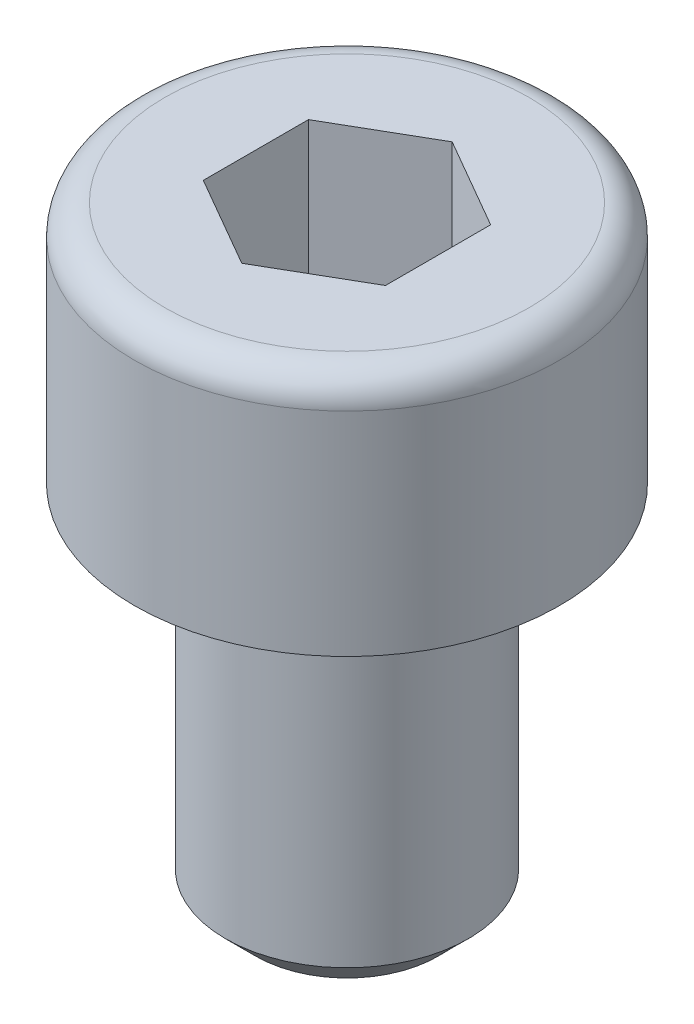
ISO-10303-21;
HEADER;
FILE_DESCRIPTION(('STEP AP214'),'2;1');
FILE_NAME('part.step','',(''),(''),'','','');
FILE_SCHEMA(('AUTOMOTIVE_DESIGN { 1 0 10303 214 1 1 1 1 }'));
ENDSEC;
DATA;
#1=APPLICATION_CONTEXT('core data for automotive mechanical design processes');
#2=APPLICATION_PROTOCOL_DEFINITION('international standard','automotive_design',2000,#1);
#3=PRODUCT_CONTEXT('',#1,'mechanical');
#4=PRODUCT('Part','Part','',(#3));
#5=PRODUCT_RELATED_PRODUCT_CATEGORY('part','',(#4));
#6=PRODUCT_DEFINITION_FORMATION('','',#4);
#7=PRODUCT_DEFINITION_CONTEXT('part definition',#1,'design');
#8=PRODUCT_DEFINITION('design','',#6,#7);
#9=PRODUCT_DEFINITION_SHAPE('','',#8);
#10=(LENGTH_UNIT() NAMED_UNIT(*) SI_UNIT(.MILLI.,.METRE.));
#11=(NAMED_UNIT(*) PLANE_ANGLE_UNIT() SI_UNIT($,.RADIAN.));
#12=(NAMED_UNIT(*) SI_UNIT($,.STERADIAN.) SOLID_ANGLE_UNIT());
#13=UNCERTAINTY_MEASURE_WITH_UNIT(LENGTH_MEASURE(1.E-05),#10,'distance_accuracy_value','');
#14=(GEOMETRIC_REPRESENTATION_CONTEXT(3) GLOBAL_UNCERTAINTY_ASSIGNED_CONTEXT((#13)) GLOBAL_UNIT_ASSIGNED_CONTEXT((#10,
#11,#12)) REPRESENTATION_CONTEXT('',''));
#15=CARTESIAN_POINT('',(0.,0.,0.));
#16=DIRECTION('',(0.,0.,1.));
#17=DIRECTION('',(1.,0.,0.));
#18=AXIS2_PLACEMENT_3D('',#15,#16,#17);
#19=CARTESIAN_POINT('',(0.,0.,0.));
#20=DIRECTION('',(0.,-1.,0.));
#21=DIRECTION('',(0.,0.,-1.));
#22=AXIS2_PLACEMENT_3D('',#19,#20,#21);
#23=PLANE('',#22);
#24=CARTESIAN_POINT('',(0.,0.,0.));
#25=DIRECTION('',(0.,-1.,0.));
#26=DIRECTION('',(0.,0.,-1.));
#27=AXIS2_PLACEMENT_3D('',#24,#25,#26);
#28=CIRCLE('',#27,3.);
#29=CARTESIAN_POINT('',(0.,0.,-3.));
#30=VERTEX_POINT('',#29);
#31=EDGE_CURVE('E47',#30,#30,#28,.F.);
#32=ORIENTED_EDGE('',*,*,#31,.T.);
#33=EDGE_LOOP('',(#32));
#34=FACE_BOUND('',#33,.T.);
#35=DIRECTION('',(-0.866025403784439,0.,-0.5));
#36=VECTOR('',#35,1.);
#37=CARTESIAN_POINT('',(1.5,0.,-0.866025403784438));
#38=LINE('',#37,#36);
#39=CARTESIAN_POINT('',(1.5,0.,-0.866025403784438));
#40=VERTEX_POINT('',#39);
#41=CARTESIAN_POINT('',(0.,0.,-1.73205080756888));
#42=VERTEX_POINT('',#41);
#43=EDGE_CURVE('E135',#40,#42,#38,.T.);
#44=ORIENTED_EDGE('',*,*,#43,.F.);
#45=DIRECTION('',(0.,0.,-1.));
#46=VECTOR('',#45,1.);
#47=CARTESIAN_POINT('',(1.5,0.,0.866025403784439));
#48=LINE('',#47,#46);
#49=CARTESIAN_POINT('',(1.5,0.,0.866025403784439));
#50=VERTEX_POINT('',#49);
#51=EDGE_CURVE('E54',#50,#40,#48,.T.);
#52=ORIENTED_EDGE('',*,*,#51,.F.);
#53=DIRECTION('',(0.866025403784439,0.,-0.5));
#54=VECTOR('',#53,1.);
#55=CARTESIAN_POINT('',(0.,0.,1.73205080756888));
#56=LINE('',#55,#54);
#57=CARTESIAN_POINT('',(0.,0.,1.73205080756888));
#58=VERTEX_POINT('',#57);
#59=EDGE_CURVE('E148',#58,#50,#56,.T.);
#60=ORIENTED_EDGE('',*,*,#59,.F.);
#61=DIRECTION('',(0.866025403784439,0.,0.5));
#62=VECTOR('',#61,1.);
#63=CARTESIAN_POINT('',(-1.5,0.,0.866025403784438));
#64=LINE('',#63,#62);
#65=CARTESIAN_POINT('',(-1.5,0.,0.866025403784438));
#66=VERTEX_POINT('',#65);
#67=EDGE_CURVE('E145',#66,#58,#64,.T.);
#68=ORIENTED_EDGE('',*,*,#67,.F.);
#69=DIRECTION('',(0.,0.,1.));
#70=VECTOR('',#69,1.);
#71=CARTESIAN_POINT('',(-1.5,0.,-0.866025403784439));
#72=LINE('',#71,#70);
#73=CARTESIAN_POINT('',(-1.5,0.,-0.866025403784439));
#74=VERTEX_POINT('',#73);
#75=EDGE_CURVE('E102',#74,#66,#72,.T.);
#76=ORIENTED_EDGE('',*,*,#75,.F.);
#77=DIRECTION('',(-0.866025403784439,0.,0.5));
#78=VECTOR('',#77,1.);
#79=CARTESIAN_POINT('',(0.,0.,-1.73205080756888));
#80=LINE('',#79,#78);
#81=EDGE_CURVE('E139',#42,#74,#80,.T.);
#82=ORIENTED_EDGE('',*,*,#81,.F.);
#83=EDGE_LOOP('',(#44,#52,#60,#68,#76,#82));
#84=FACE_BOUND('',#83,.T.);
#85=ADVANCED_FACE('F38',(#34,#84),#23,.F.);
#86=CARTESIAN_POINT('',(0.,0.,0.));
#87=DIRECTION('',(0.,1.,0.));
#88=DIRECTION('',(0.,0.,1.));
#89=AXIS2_PLACEMENT_3D('',#86,#87,#88);
#90=CYLINDRICAL_SURFACE('',#89,3.5);
#91=CARTESIAN_POINT('',(0.,-0.5,0.));
#92=DIRECTION('',(0.,-1.,0.));
#93=DIRECTION('',(0.,0.,-1.));
#94=AXIS2_PLACEMENT_3D('',#91,#92,#93);
#95=CIRCLE('',#94,3.5);
#96=CARTESIAN_POINT('',(0.,-0.5,-3.5));
#97=VERTEX_POINT('',#96);
#98=EDGE_CURVE('E11',#97,#97,#95,.T.);
#99=ORIENTED_EDGE('',*,*,#98,.T.);
#100=EDGE_LOOP('',(#99));
#101=FACE_BOUND('',#100,.T.);
#102=CARTESIAN_POINT('',(0.,-4.,0.));
#103=DIRECTION('',(0.,1.,0.));
#104=DIRECTION('',(0.,0.,1.));
#105=AXIS2_PLACEMENT_3D('',#102,#103,#104);
#106=CIRCLE('',#105,3.5);
#107=CARTESIAN_POINT('',(0.,-4.,3.5));
#108=VERTEX_POINT('',#107);
#109=EDGE_CURVE('E166',#108,#108,#106,.T.);
#110=ORIENTED_EDGE('',*,*,#109,.T.);
#111=EDGE_LOOP('',(#110));
#112=FACE_BOUND('',#111,.T.);
#113=ADVANCED_FACE('F192',(#101,#112),#90,.T.);
#114=CARTESIAN_POINT('',(3.5,-4.,0.));
#115=DIRECTION('',(0.,1.,0.));
#116=DIRECTION('',(0.,0.,1.));
#117=AXIS2_PLACEMENT_3D('',#114,#115,#116);
#118=PLANE('',#117);
#119=ORIENTED_EDGE('',*,*,#109,.F.);
#120=EDGE_LOOP('',(#119));
#121=FACE_BOUND('',#120,.T.);
#122=CARTESIAN_POINT('',(0.,-4.,0.));
#123=DIRECTION('',(0.,1.,0.));
#124=DIRECTION('',(0.,0.,1.));
#125=AXIS2_PLACEMENT_3D('',#122,#123,#124);
#126=CIRCLE('',#125,2.);
#127=CARTESIAN_POINT('',(0.,-4.,2.));
#128=VERTEX_POINT('',#127);
#129=EDGE_CURVE('E154',#128,#128,#126,.T.);
#130=ORIENTED_EDGE('',*,*,#129,.T.);
#131=EDGE_LOOP('',(#130));
#132=FACE_BOUND('',#131,.T.);
#133=ADVANCED_FACE('F197',(#121,#132),#118,.F.);
#134=CARTESIAN_POINT('',(0.,0.,0.));
#135=DIRECTION('',(0.,1.,0.));
#136=DIRECTION('',(0.,0.,1.));
#137=AXIS2_PLACEMENT_3D('',#134,#135,#136);
#138=CYLINDRICAL_SURFACE('',#137,2.);
#139=CARTESIAN_POINT('',(0.,-9.5,0.));
#140=DIRECTION('',(0.,1.,0.));
#141=DIRECTION('',(0.,0.,1.));
#142=AXIS2_PLACEMENT_3D('',#139,#140,#141);
#143=CIRCLE('',#142,2.);
#144=CARTESIAN_POINT('',(0.,-9.5,2.));
#145=VERTEX_POINT('',#144);
#146=EDGE_CURVE('E170',#145,#145,#143,.T.);
#147=ORIENTED_EDGE('',*,*,#146,.T.);
#148=EDGE_LOOP('',(#147));
#149=FACE_BOUND('',#148,.T.);
#150=ORIENTED_EDGE('',*,*,#129,.F.);
#151=EDGE_LOOP('',(#150));
#152=FACE_BOUND('',#151,.T.);
#153=ADVANCED_FACE('F203',(#149,#152),#138,.T.);
#154=CARTESIAN_POINT('',(2.,-10.,0.));
#155=DIRECTION('',(0.,1.,0.));
#156=DIRECTION('',(0.,0.,1.));
#157=AXIS2_PLACEMENT_3D('',#154,#155,#156);
#158=PLANE('',#157);
#159=CARTESIAN_POINT('',(0.,-10.,0.));
#160=DIRECTION('',(0.,1.,0.));
#161=DIRECTION('',(0.,0.,1.));
#162=AXIS2_PLACEMENT_3D('',#159,#160,#161);
#163=CIRCLE('',#162,1.5);
#164=CARTESIAN_POINT('',(0.,-10.,1.5));
#165=VERTEX_POINT('',#164);
#166=EDGE_CURVE('E174',#165,#165,#163,.F.);
#167=ORIENTED_EDGE('',*,*,#166,.T.);
#168=EDGE_LOOP('',(#167));
#169=FACE_BOUND('',#168,.T.);
#170=ADVANCED_FACE('F207',(#169),#158,.F.);
#171=CARTESIAN_POINT('',(1.5,-3.,0.866025403784439));
#172=DIRECTION('',(1.,0.,0.));
#173=DIRECTION('',(0.,0.,-1.));
#174=AXIS2_PLACEMENT_3D('',#171,#172,#173);
#175=PLANE('',#174);
#176=ORIENTED_EDGE('',*,*,#51,.T.);
#177=DIRECTION('',(0.,1.,0.));
#178=VECTOR('',#177,1.);
#179=CARTESIAN_POINT('',(1.5,-3.,-0.866025403784438));
#180=LINE('',#179,#178);
#181=CARTESIAN_POINT('',(1.5,-3.,-0.866025403784438));
#182=VERTEX_POINT('',#181);
#183=EDGE_CURVE('E84',#182,#40,#180,.T.);
#184=ORIENTED_EDGE('',*,*,#183,.F.);
#185=DIRECTION('',(0.,0.,-1.));
#186=VECTOR('',#185,1.);
#187=CARTESIAN_POINT('',(1.5,-3.,0.866025403784439));
#188=LINE('',#187,#186);
#189=CARTESIAN_POINT('',(1.5,-3.,0.866025403784439));
#190=VERTEX_POINT('',#189);
#191=EDGE_CURVE('E151',#190,#182,#188,.T.);
#192=ORIENTED_EDGE('',*,*,#191,.F.);
#193=DIRECTION('',(0.,1.,0.));
#194=VECTOR('',#193,1.);
#195=CARTESIAN_POINT('',(1.5,-3.,0.866025403784439));
#196=LINE('',#195,#194);
#197=EDGE_CURVE('E62',#190,#50,#196,.T.);
#198=ORIENTED_EDGE('',*,*,#197,.T.);
#199=EDGE_LOOP('',(#176,#184,#192,#198));
#200=FACE_BOUND('',#199,.T.);
#201=ADVANCED_FACE('F211',(#200),#175,.F.);
#202=CARTESIAN_POINT('',(0.,-3.,1.73205080756888));
#203=DIRECTION('',(0.5,0.,0.866025403784439));
#204=DIRECTION('',(0.866025403784439,0.,-0.5));
#205=AXIS2_PLACEMENT_3D('',#202,#203,#204);
#206=PLANE('',#205);
#207=ORIENTED_EDGE('',*,*,#59,.T.);
#208=ORIENTED_EDGE('',*,*,#197,.F.);
#209=DIRECTION('',(0.866025403784439,0.,-0.5));
#210=VECTOR('',#209,1.);
#211=CARTESIAN_POINT('',(0.,-3.,1.73205080756888));
#212=LINE('',#211,#210);
#213=CARTESIAN_POINT('',(0.,-3.,1.73205080756888));
#214=VERTEX_POINT('',#213);
#215=EDGE_CURVE('E116',#214,#190,#212,.T.);
#216=ORIENTED_EDGE('',*,*,#215,.F.);
#217=DIRECTION('',(0.,1.,0.));
#218=VECTOR('',#217,1.);
#219=CARTESIAN_POINT('',(0.,-3.,1.73205080756888));
#220=LINE('',#219,#218);
#221=EDGE_CURVE('E107',#214,#58,#220,.T.);
#222=ORIENTED_EDGE('',*,*,#221,.T.);
#223=EDGE_LOOP('',(#207,#208,#216,#222));
#224=FACE_BOUND('',#223,.T.);
#225=ADVANCED_FACE('F215',(#224),#206,.F.);
#226=CARTESIAN_POINT('',(-1.5,-3.,0.866025403784438));
#227=DIRECTION('',(-0.5,0.,0.866025403784438));
#228=DIRECTION('',(0.866025403784439,0.,0.5));
#229=AXIS2_PLACEMENT_3D('',#226,#227,#228);
#230=PLANE('',#229);
#231=ORIENTED_EDGE('',*,*,#67,.T.);
#232=ORIENTED_EDGE('',*,*,#221,.F.);
#233=DIRECTION('',(0.866025403784439,0.,0.5));
#234=VECTOR('',#233,1.);
#235=CARTESIAN_POINT('',(-1.5,-3.,0.866025403784438));
#236=LINE('',#235,#234);
#237=CARTESIAN_POINT('',(-1.5,-3.,0.866025403784438));
#238=VERTEX_POINT('',#237);
#239=EDGE_CURVE('E111',#238,#214,#236,.T.);
#240=ORIENTED_EDGE('',*,*,#239,.F.);
#241=DIRECTION('',(0.,1.,0.));
#242=VECTOR('',#241,1.);
#243=CARTESIAN_POINT('',(-1.5,-3.,0.866025403784438));
#244=LINE('',#243,#242);
#245=EDGE_CURVE('E95',#238,#66,#244,.T.);
#246=ORIENTED_EDGE('',*,*,#245,.T.);
#247=EDGE_LOOP('',(#231,#232,#240,#246));
#248=FACE_BOUND('',#247,.T.);
#249=ADVANCED_FACE('F112',(#248),#230,.F.);
#250=CARTESIAN_POINT('',(-1.5,-3.,-0.866025403784439));
#251=DIRECTION('',(-1.,0.,0.));
#252=DIRECTION('',(0.,0.,1.));
#253=AXIS2_PLACEMENT_3D('',#250,#251,#252);
#254=PLANE('',#253);
#255=ORIENTED_EDGE('',*,*,#75,.T.);
#256=ORIENTED_EDGE('',*,*,#245,.F.);
#257=DIRECTION('',(0.,0.,1.));
#258=VECTOR('',#257,1.);
#259=CARTESIAN_POINT('',(-1.5,-3.,-0.866025403784439));
#260=LINE('',#259,#258);
#261=CARTESIAN_POINT('',(-1.5,-3.,-0.866025403784439));
#262=VERTEX_POINT('',#261);
#263=EDGE_CURVE('E99',#262,#238,#260,.T.);
#264=ORIENTED_EDGE('',*,*,#263,.F.);
#265=DIRECTION('',(0.,1.,0.));
#266=VECTOR('',#265,1.);
#267=CARTESIAN_POINT('',(-1.5,-3.,-0.866025403784439));
#268=LINE('',#267,#266);
#269=EDGE_CURVE('E108',#262,#74,#268,.T.);
#270=ORIENTED_EDGE('',*,*,#269,.T.);
#271=EDGE_LOOP('',(#255,#256,#264,#270));
#272=FACE_BOUND('',#271,.T.);
#273=ADVANCED_FACE('F97',(#272),#254,.F.);
#274=CARTESIAN_POINT('',(0.,-3.,-1.73205080756888));
#275=DIRECTION('',(-0.5,0.,-0.866025403784439));
#276=DIRECTION('',(-0.866025403784439,0.,0.5));
#277=AXIS2_PLACEMENT_3D('',#274,#275,#276);
#278=PLANE('',#277);
#279=ORIENTED_EDGE('',*,*,#81,.T.);
#280=ORIENTED_EDGE('',*,*,#269,.F.);
#281=DIRECTION('',(-0.866025403784439,0.,0.5));
#282=VECTOR('',#281,1.);
#283=CARTESIAN_POINT('',(0.,-3.,-1.73205080756888));
#284=LINE('',#283,#282);
#285=CARTESIAN_POINT('',(0.,-3.,-1.73205080756888));
#286=VERTEX_POINT('',#285);
#287=EDGE_CURVE('E122',#286,#262,#284,.T.);
#288=ORIENTED_EDGE('',*,*,#287,.F.);
#289=DIRECTION('',(0.,1.,0.));
#290=VECTOR('',#289,1.);
#291=CARTESIAN_POINT('',(0.,-3.,-1.73205080756888));
#292=LINE('',#291,#290);
#293=EDGE_CURVE('E158',#286,#42,#292,.T.);
#294=ORIENTED_EDGE('',*,*,#293,.T.);
#295=EDGE_LOOP('',(#279,#280,#288,#294));
#296=FACE_BOUND('',#295,.T.);
#297=ADVANCED_FACE('F219',(#296),#278,.F.);
#298=CARTESIAN_POINT('',(1.5,-3.,-0.866025403784438));
#299=DIRECTION('',(0.5,0.,-0.866025403784439));
#300=DIRECTION('',(-0.866025403784439,0.,-0.5));
#301=AXIS2_PLACEMENT_3D('',#298,#299,#300);
#302=PLANE('',#301);
#303=ORIENTED_EDGE('',*,*,#43,.T.);
#304=ORIENTED_EDGE('',*,*,#293,.F.);
#305=DIRECTION('',(-0.866025403784439,0.,-0.5));
#306=VECTOR('',#305,1.);
#307=CARTESIAN_POINT('',(1.5,-3.,-0.866025403784438));
#308=LINE('',#307,#306);
#309=EDGE_CURVE('E127',#182,#286,#308,.T.);
#310=ORIENTED_EDGE('',*,*,#309,.F.);
#311=ORIENTED_EDGE('',*,*,#183,.T.);
#312=EDGE_LOOP('',(#303,#304,#310,#311));
#313=FACE_BOUND('',#312,.T.);
#314=ADVANCED_FACE('F216',(#313),#302,.F.);
#315=CARTESIAN_POINT('',(1.5,-3.,-0.866025403784438));
#316=DIRECTION('',(0.,1.,0.));
#317=DIRECTION('',(0.,0.,1.));
#318=AXIS2_PLACEMENT_3D('',#315,#316,#317);
#319=PLANE('',#318);
#320=ORIENTED_EDGE('',*,*,#191,.T.);
#321=ORIENTED_EDGE('',*,*,#309,.T.);
#322=ORIENTED_EDGE('',*,*,#287,.T.);
#323=ORIENTED_EDGE('',*,*,#263,.T.);
#324=ORIENTED_EDGE('',*,*,#239,.T.);
#325=ORIENTED_EDGE('',*,*,#215,.T.);
#326=EDGE_LOOP('',(#320,#321,#322,#323,#324,#325));
#327=FACE_BOUND('',#326,.T.);
#328=ADVANCED_FACE('F119',(#327),#319,.T.);
#329=CARTESIAN_POINT('',(0.,-9.5,0.));
#330=DIRECTION('',(0.,1.,0.));
#331=DIRECTION('',(0.,0.,1.));
#332=AXIS2_PLACEMENT_3D('',#329,#330,#331);
#333=CONICAL_SURFACE('',#332,2.,0.785398163397449);
#334=ORIENTED_EDGE('',*,*,#166,.F.);
#335=EDGE_LOOP('',(#334));
#336=FACE_BOUND('',#335,.T.);
#337=ORIENTED_EDGE('',*,*,#146,.F.);
#338=EDGE_LOOP('',(#337));
#339=FACE_BOUND('',#338,.T.);
#340=ADVANCED_FACE('F184',(#336,#339),#333,.T.);
#341=CARTESIAN_POINT('',(0.,-0.5,0.));
#342=DIRECTION('',(0.,-1.,0.));
#343=DIRECTION('',(0.,0.,-1.));
#344=AXIS2_PLACEMENT_3D('',#341,#342,#343);
#345=TOROIDAL_SURFACE('',#344,3.,0.5);
#346=ORIENTED_EDGE('',*,*,#98,.F.);
#347=EDGE_LOOP('',(#346));
#348=FACE_BOUND('',#347,.T.);
#349=ORIENTED_EDGE('',*,*,#31,.F.);
#350=EDGE_LOOP('',(#349));
#351=FACE_BOUND('',#350,.T.);
#352=ADVANCED_FACE('F40',(#348,#351),#345,.T.);
#353=CLOSED_SHELL('',(#85,#113,#133,#153,#170,#201,#225,#249,#273,#297,#314,#328,#340,#352));
#354=MANIFOLD_SOLID_BREP('B2',#353);
#355=ADVANCED_BREP_SHAPE_REPRESENTATION('',(#18,#354),#14);
#356=SHAPE_DEFINITION_REPRESENTATION(#9,#355);
ENDSEC;
END-ISO-10303-21;
